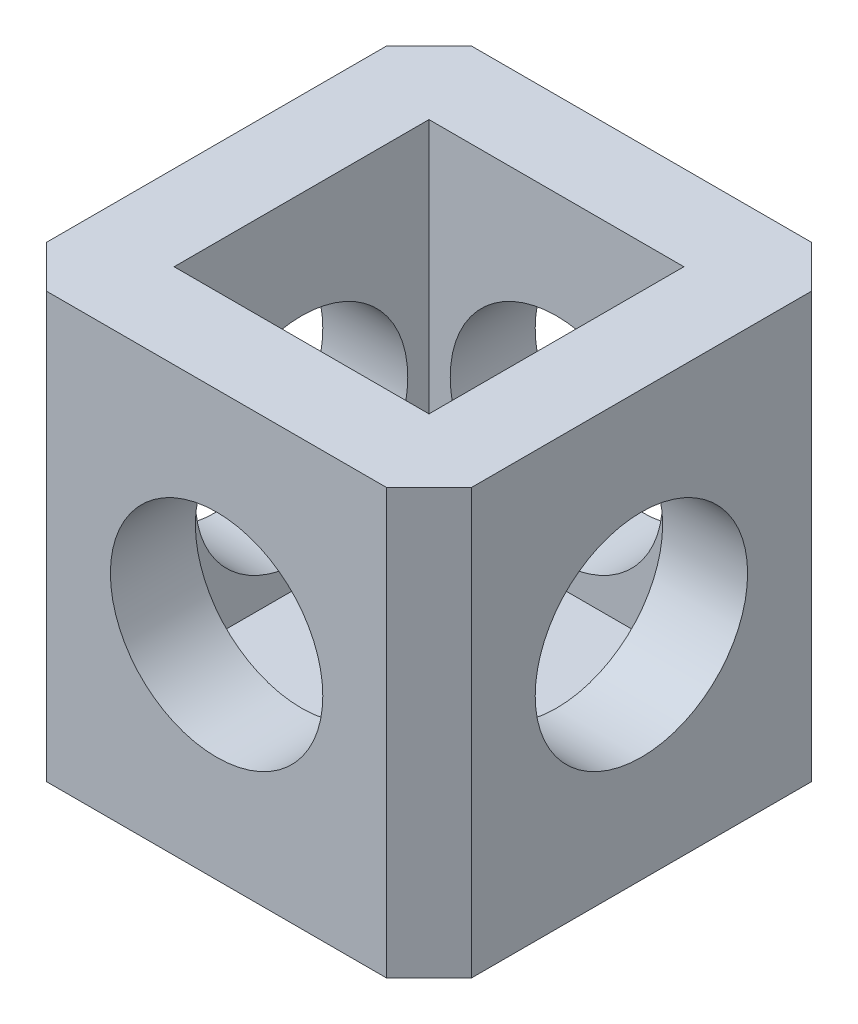
ISO-10303-21;
HEADER;
FILE_DESCRIPTION(('STEP AP214'),'2;1');
FILE_NAME('part.step','',(''),(''),'','','');
FILE_SCHEMA(('AUTOMOTIVE_DESIGN { 1 0 10303 214 1 1 1 1 }'));
ENDSEC;
DATA;
#1=APPLICATION_CONTEXT('core data for automotive mechanical design processes');
#2=APPLICATION_PROTOCOL_DEFINITION('international standard','automotive_design',2000,#1);
#3=PRODUCT_CONTEXT('',#1,'mechanical');
#4=PRODUCT('Part','Part','',(#3));
#5=PRODUCT_RELATED_PRODUCT_CATEGORY('part','',(#4));
#6=PRODUCT_DEFINITION_FORMATION('','',#4);
#7=PRODUCT_DEFINITION_CONTEXT('part definition',#1,'design');
#8=PRODUCT_DEFINITION('design','',#6,#7);
#9=PRODUCT_DEFINITION_SHAPE('','',#8);
#10=(LENGTH_UNIT() NAMED_UNIT(*) SI_UNIT(.MILLI.,.METRE.));
#11=(NAMED_UNIT(*) PLANE_ANGLE_UNIT() SI_UNIT($,.RADIAN.));
#12=(NAMED_UNIT(*) SI_UNIT($,.STERADIAN.) SOLID_ANGLE_UNIT());
#13=UNCERTAINTY_MEASURE_WITH_UNIT(LENGTH_MEASURE(1.E-05),#10,'distance_accuracy_value','');
#14=(GEOMETRIC_REPRESENTATION_CONTEXT(3) GLOBAL_UNCERTAINTY_ASSIGNED_CONTEXT((#13)) GLOBAL_UNIT_ASSIGNED_CONTEXT((#10,
#11,#12)) REPRESENTATION_CONTEXT('',''));
#15=CARTESIAN_POINT('',(0.,0.,0.));
#16=DIRECTION('',(0.,0.,1.));
#17=DIRECTION('',(1.,0.,0.));
#18=AXIS2_PLACEMENT_3D('',#15,#16,#17);
#19=CARTESIAN_POINT('',(-10.,4.,-10.));
#20=DIRECTION('',(0.,0.,1.));
#21=DIRECTION('',(1.,0.,0.));
#22=AXIS2_PLACEMENT_3D('',#19,#20,#21);
#23=PLANE('',#22);
#24=CARTESIAN_POINT('',(0.,10.,-10.));
#25=DIRECTION('',(0.,0.,1.));
#26=DIRECTION('',(1.,0.,0.));
#27=AXIS2_PLACEMENT_3D('',#24,#25,#26);
#28=CIRCLE('',#27,5.);
#29=CARTESIAN_POINT('',(5.,10.,-10.));
#30=VERTEX_POINT('',#29);
#31=EDGE_CURVE('E336',#30,#30,#28,.T.);
#32=ORIENTED_EDGE('',*,*,#31,.T.);
#33=EDGE_LOOP('',(#32));
#34=FACE_BOUND('',#33,.T.);
#35=DIRECTION('',(-1.,0.,0.));
#36=VECTOR('',#35,1.);
#37=CARTESIAN_POINT('',(-10.,20.,-10.));
#38=LINE('',#37,#36);
#39=CARTESIAN_POINT('',(8.,20.,-10.));
#40=VERTEX_POINT('',#39);
#41=CARTESIAN_POINT('',(-7.99999999999999,20.,-10.));
#42=VERTEX_POINT('',#41);
#43=EDGE_CURVE('E178',#40,#42,#38,.T.);
#44=ORIENTED_EDGE('',*,*,#43,.F.);
#45=DIRECTION('',(0.,-1.,0.));
#46=VECTOR('',#45,1.);
#47=CARTESIAN_POINT('',(8.,4.,-10.));
#48=LINE('',#47,#46);
#49=CARTESIAN_POINT('',(8.,0.,-10.));
#50=VERTEX_POINT('',#49);
#51=EDGE_CURVE('E11',#40,#50,#48,.T.);
#52=ORIENTED_EDGE('',*,*,#51,.T.);
#53=DIRECTION('',(-1.,0.,0.));
#54=VECTOR('',#53,1.);
#55=CARTESIAN_POINT('',(-10.,0.,-10.));
#56=LINE('',#55,#54);
#57=CARTESIAN_POINT('',(-7.99999999999999,0.,-10.));
#58=VERTEX_POINT('',#57);
#59=EDGE_CURVE('E180',#50,#58,#56,.T.);
#60=ORIENTED_EDGE('',*,*,#59,.T.);
#61=DIRECTION('',(0.,1.,0.));
#62=VECTOR('',#61,1.);
#63=CARTESIAN_POINT('',(-7.99999999999999,4.,-10.));
#64=LINE('',#63,#62);
#65=EDGE_CURVE('E44',#58,#42,#64,.T.);
#66=ORIENTED_EDGE('',*,*,#65,.T.);
#67=EDGE_LOOP('',(#44,#52,#60,#66));
#68=FACE_BOUND('',#67,.T.);
#69=ADVANCED_FACE('F35',(#34,#68),#23,.F.);
#70=CARTESIAN_POINT('',(-10.,4.,10.));
#71=DIRECTION('',(1.,0.,0.));
#72=DIRECTION('',(0.,0.,-1.));
#73=AXIS2_PLACEMENT_3D('',#70,#71,#72);
#74=PLANE('',#73);
#75=CARTESIAN_POINT('',(-10.,10.,0.));
#76=DIRECTION('',(1.,0.,0.));
#77=DIRECTION('',(0.,0.,-1.));
#78=AXIS2_PLACEMENT_3D('',#75,#76,#77);
#79=CIRCLE('',#78,5.);
#80=CARTESIAN_POINT('',(-10.,10.,-5.));
#81=VERTEX_POINT('',#80);
#82=EDGE_CURVE('E161',#81,#81,#79,.T.);
#83=ORIENTED_EDGE('',*,*,#82,.T.);
#84=EDGE_LOOP('',(#83));
#85=FACE_BOUND('',#84,.T.);
#86=DIRECTION('',(0.,0.,1.));
#87=VECTOR('',#86,1.);
#88=CARTESIAN_POINT('',(-10.,0.,10.));
#89=LINE('',#88,#87);
#90=CARTESIAN_POINT('',(-10.,0.,-8.));
#91=VERTEX_POINT('',#90);
#92=CARTESIAN_POINT('',(-10.,0.,7.99999999999999));
#93=VERTEX_POINT('',#92);
#94=EDGE_CURVE('E182',#91,#93,#89,.T.);
#95=ORIENTED_EDGE('',*,*,#94,.T.);
#96=DIRECTION('',(0.,1.,0.));
#97=VECTOR('',#96,1.);
#98=CARTESIAN_POINT('',(-10.,4.,7.99999999999999));
#99=LINE('',#98,#97);
#100=CARTESIAN_POINT('',(-10.,20.,7.99999999999999));
#101=VERTEX_POINT('',#100);
#102=EDGE_CURVE('E217',#93,#101,#99,.T.);
#103=ORIENTED_EDGE('',*,*,#102,.T.);
#104=DIRECTION('',(0.,0.,1.));
#105=VECTOR('',#104,1.);
#106=CARTESIAN_POINT('',(-10.,20.,-10.));
#107=LINE('',#106,#105);
#108=CARTESIAN_POINT('',(-10.,20.,-8.));
#109=VERTEX_POINT('',#108);
#110=EDGE_CURVE('E146',#109,#101,#107,.T.);
#111=ORIENTED_EDGE('',*,*,#110,.F.);
#112=DIRECTION('',(0.,-1.,0.));
#113=VECTOR('',#112,1.);
#114=CARTESIAN_POINT('',(-10.,4.,-8.));
#115=LINE('',#114,#113);
#116=EDGE_CURVE('E214',#109,#91,#115,.T.);
#117=ORIENTED_EDGE('',*,*,#116,.T.);
#118=EDGE_LOOP('',(#95,#103,#111,#117));
#119=FACE_BOUND('',#118,.T.);
#120=ADVANCED_FACE('F251',(#85,#119),#74,.F.);
#121=CARTESIAN_POINT('',(-10.,4.,10.));
#122=DIRECTION('',(0.,0.,-1.));
#123=DIRECTION('',(-1.,0.,0.));
#124=AXIS2_PLACEMENT_3D('',#121,#122,#123);
#125=PLANE('',#124);
#126=CARTESIAN_POINT('',(0.,10.,10.));
#127=DIRECTION('',(0.,0.,1.));
#128=DIRECTION('',(1.,0.,0.));
#129=AXIS2_PLACEMENT_3D('',#126,#127,#128);
#130=CIRCLE('',#129,5.);
#131=CARTESIAN_POINT('',(5.,10.,10.));
#132=VERTEX_POINT('',#131);
#133=EDGE_CURVE('E201',#132,#132,#130,.T.);
#134=ORIENTED_EDGE('',*,*,#133,.F.);
#135=EDGE_LOOP('',(#134));
#136=FACE_BOUND('',#135,.T.);
#137=DIRECTION('',(1.,0.,0.));
#138=VECTOR('',#137,1.);
#139=CARTESIAN_POINT('',(-10.,20.,10.));
#140=LINE('',#139,#138);
#141=CARTESIAN_POINT('',(-8.,20.,10.));
#142=VERTEX_POINT('',#141);
#143=CARTESIAN_POINT('',(7.99999999999999,20.,10.));
#144=VERTEX_POINT('',#143);
#145=EDGE_CURVE('E173',#142,#144,#140,.T.);
#146=ORIENTED_EDGE('',*,*,#145,.F.);
#147=DIRECTION('',(0.,-1.,0.));
#148=VECTOR('',#147,1.);
#149=CARTESIAN_POINT('',(-8.,4.,10.));
#150=LINE('',#149,#148);
#151=CARTESIAN_POINT('',(-8.,0.,10.));
#152=VERTEX_POINT('',#151);
#153=EDGE_CURVE('E203',#142,#152,#150,.T.);
#154=ORIENTED_EDGE('',*,*,#153,.T.);
#155=DIRECTION('',(1.,0.,0.));
#156=VECTOR('',#155,1.);
#157=CARTESIAN_POINT('',(-10.,0.,10.));
#158=LINE('',#157,#156);
#159=CARTESIAN_POINT('',(7.99999999999999,0.,10.));
#160=VERTEX_POINT('',#159);
#161=EDGE_CURVE('E185',#152,#160,#158,.T.);
#162=ORIENTED_EDGE('',*,*,#161,.T.);
#163=DIRECTION('',(0.,1.,0.));
#164=VECTOR('',#163,1.);
#165=CARTESIAN_POINT('',(7.99999999999999,4.,10.));
#166=LINE('',#165,#164);
#167=EDGE_CURVE('E191',#160,#144,#166,.T.);
#168=ORIENTED_EDGE('',*,*,#167,.T.);
#169=EDGE_LOOP('',(#146,#154,#162,#168));
#170=FACE_BOUND('',#169,.T.);
#171=ADVANCED_FACE('F259',(#136,#170),#125,.F.);
#172=CARTESIAN_POINT('',(10.,4.,10.));
#173=DIRECTION('',(-1.,0.,0.));
#174=DIRECTION('',(0.,0.,1.));
#175=AXIS2_PLACEMENT_3D('',#172,#173,#174);
#176=PLANE('',#175);
#177=CARTESIAN_POINT('',(10.,10.,0.));
#178=DIRECTION('',(1.,0.,0.));
#179=DIRECTION('',(0.,0.,-1.));
#180=AXIS2_PLACEMENT_3D('',#177,#178,#179);
#181=CIRCLE('',#180,5.);
#182=CARTESIAN_POINT('',(10.,10.,-5.));
#183=VERTEX_POINT('',#182);
#184=EDGE_CURVE('E196',#183,#183,#181,.T.);
#185=ORIENTED_EDGE('',*,*,#184,.F.);
#186=EDGE_LOOP('',(#185));
#187=FACE_BOUND('',#186,.T.);
#188=DIRECTION('',(0.,0.,-1.));
#189=VECTOR('',#188,1.);
#190=CARTESIAN_POINT('',(10.,20.,-10.));
#191=LINE('',#190,#189);
#192=CARTESIAN_POINT('',(10.,20.,8.));
#193=VERTEX_POINT('',#192);
#194=CARTESIAN_POINT('',(10.,20.,-7.99999999999999));
#195=VERTEX_POINT('',#194);
#196=EDGE_CURVE('E176',#193,#195,#191,.T.);
#197=ORIENTED_EDGE('',*,*,#196,.F.);
#198=DIRECTION('',(0.,-1.,0.));
#199=VECTOR('',#198,1.);
#200=CARTESIAN_POINT('',(10.,4.,8.));
#201=LINE('',#200,#199);
#202=CARTESIAN_POINT('',(10.,0.,8.));
#203=VERTEX_POINT('',#202);
#204=EDGE_CURVE('E228',#193,#203,#201,.T.);
#205=ORIENTED_EDGE('',*,*,#204,.T.);
#206=DIRECTION('',(0.,0.,-1.));
#207=VECTOR('',#206,1.);
#208=CARTESIAN_POINT('',(10.,0.,10.));
#209=LINE('',#208,#207);
#210=CARTESIAN_POINT('',(10.,0.,-7.99999999999999));
#211=VERTEX_POINT('',#210);
#212=EDGE_CURVE('E188',#203,#211,#209,.T.);
#213=ORIENTED_EDGE('',*,*,#212,.T.);
#214=DIRECTION('',(0.,1.,0.));
#215=VECTOR('',#214,1.);
#216=CARTESIAN_POINT('',(10.,4.,-7.99999999999999));
#217=LINE('',#216,#215);
#218=EDGE_CURVE('E226',#211,#195,#217,.T.);
#219=ORIENTED_EDGE('',*,*,#218,.T.);
#220=EDGE_LOOP('',(#197,#205,#213,#219));
#221=FACE_BOUND('',#220,.T.);
#222=ADVANCED_FACE('F234',(#187,#221),#176,.F.);
#223=CARTESIAN_POINT('',(0.,0.,0.));
#224=DIRECTION('',(0.,1.,0.));
#225=DIRECTION('',(0.,0.,1.));
#226=AXIS2_PLACEMENT_3D('',#223,#224,#225);
#227=PLANE('',#226);
#228=ORIENTED_EDGE('',*,*,#161,.F.);
#229=DIRECTION('',(0.707106781186547,0.,0.707106781186548));
#230=VECTOR('',#229,1.);
#231=CARTESIAN_POINT('',(-8.,0.,10.));
#232=LINE('',#231,#230);
#233=EDGE_CURVE('E212',#152,#93,#232,.F.);
#234=ORIENTED_EDGE('',*,*,#233,.T.);
#235=ORIENTED_EDGE('',*,*,#94,.F.);
#236=DIRECTION('',(-0.707106781186548,0.,0.707106781186547));
#237=VECTOR('',#236,1.);
#238=CARTESIAN_POINT('',(-10.,0.,-8.));
#239=LINE('',#238,#237);
#240=EDGE_CURVE('E206',#91,#58,#239,.F.);
#241=ORIENTED_EDGE('',*,*,#240,.T.);
#242=ORIENTED_EDGE('',*,*,#59,.F.);
#243=DIRECTION('',(-0.707106781186547,0.,-0.707106781186548));
#244=VECTOR('',#243,1.);
#245=CARTESIAN_POINT('',(8.,0.,-10.));
#246=LINE('',#245,#244);
#247=EDGE_CURVE('E208',#50,#211,#246,.F.);
#248=ORIENTED_EDGE('',*,*,#247,.T.);
#249=ORIENTED_EDGE('',*,*,#212,.F.);
#250=DIRECTION('',(0.707106781186548,0.,-0.707106781186547));
#251=VECTOR('',#250,1.);
#252=CARTESIAN_POINT('',(10.,0.,8.));
#253=LINE('',#252,#251);
#254=EDGE_CURVE('E210',#203,#160,#253,.F.);
#255=ORIENTED_EDGE('',*,*,#254,.T.);
#256=EDGE_LOOP('',(#228,#234,#235,#241,#242,#248,#249,#255));
#257=FACE_BOUND('',#256,.T.);
#258=ADVANCED_FACE('F240',(#257),#227,.F.);
#259=CARTESIAN_POINT('',(0.,20.,0.));
#260=DIRECTION('',(0.,1.,0.));
#261=DIRECTION('',(0.,0.,1.));
#262=AXIS2_PLACEMENT_3D('',#259,#260,#261);
#263=PLANE('',#262);
#264=ORIENTED_EDGE('',*,*,#110,.T.);
#265=DIRECTION('',(-0.707106781186547,0.,-0.707106781186548));
#266=VECTOR('',#265,1.);
#267=CARTESIAN_POINT('',(-9.00000000000001,20.,8.99999999999999));
#268=LINE('',#267,#266);
#269=EDGE_CURVE('E224',#101,#142,#268,.F.);
#270=ORIENTED_EDGE('',*,*,#269,.T.);
#271=ORIENTED_EDGE('',*,*,#145,.T.);
#272=DIRECTION('',(-0.707106781186548,0.,0.707106781186547));
#273=VECTOR('',#272,1.);
#274=CARTESIAN_POINT('',(8.99999999999999,20.,9.00000000000001));
#275=LINE('',#274,#273);
#276=EDGE_CURVE('E222',#144,#193,#275,.F.);
#277=ORIENTED_EDGE('',*,*,#276,.T.);
#278=ORIENTED_EDGE('',*,*,#196,.T.);
#279=DIRECTION('',(0.707106781186547,0.,0.707106781186548));
#280=VECTOR('',#279,1.);
#281=CARTESIAN_POINT('',(9.00000000000001,20.,-8.99999999999999));
#282=LINE('',#281,#280);
#283=EDGE_CURVE('E57',#195,#40,#282,.F.);
#284=ORIENTED_EDGE('',*,*,#283,.T.);
#285=ORIENTED_EDGE('',*,*,#43,.T.);
#286=DIRECTION('',(0.707106781186548,0.,-0.707106781186547));
#287=VECTOR('',#286,1.);
#288=CARTESIAN_POINT('',(-8.99999999999999,20.,-9.00000000000001));
#289=LINE('',#288,#287);
#290=EDGE_CURVE('E219',#42,#109,#289,.F.);
#291=ORIENTED_EDGE('',*,*,#290,.T.);
#292=EDGE_LOOP('',(#264,#270,#271,#277,#278,#284,#285,#291));
#293=FACE_BOUND('',#292,.T.);
#294=DIRECTION('',(1.,0.,0.));
#295=VECTOR('',#294,1.);
#296=CARTESIAN_POINT('',(-6.,20.,6.));
#297=LINE('',#296,#295);
#298=CARTESIAN_POINT('',(-6.,20.,6.));
#299=VERTEX_POINT('',#298);
#300=CARTESIAN_POINT('',(6.,20.,6.));
#301=VERTEX_POINT('',#300);
#302=EDGE_CURVE('E137',#299,#301,#297,.T.);
#303=ORIENTED_EDGE('',*,*,#302,.F.);
#304=DIRECTION('',(0.,0.,1.));
#305=VECTOR('',#304,1.);
#306=CARTESIAN_POINT('',(-6.,20.,-6.));
#307=LINE('',#306,#305);
#308=CARTESIAN_POINT('',(-6.,20.,-6.));
#309=VERTEX_POINT('',#308);
#310=EDGE_CURVE('E127',#309,#299,#307,.T.);
#311=ORIENTED_EDGE('',*,*,#310,.F.);
#312=DIRECTION('',(-1.,0.,0.));
#313=VECTOR('',#312,1.);
#314=CARTESIAN_POINT('',(-6.,20.,-6.));
#315=LINE('',#314,#313);
#316=CARTESIAN_POINT('',(6.,20.,-6.));
#317=VERTEX_POINT('',#316);
#318=EDGE_CURVE('E154',#317,#309,#315,.T.);
#319=ORIENTED_EDGE('',*,*,#318,.F.);
#320=DIRECTION('',(0.,0.,-1.));
#321=VECTOR('',#320,1.);
#322=CARTESIAN_POINT('',(6.,20.,-6.));
#323=LINE('',#322,#321);
#324=EDGE_CURVE('E152',#301,#317,#323,.T.);
#325=ORIENTED_EDGE('',*,*,#324,.F.);
#326=EDGE_LOOP('',(#303,#311,#319,#325));
#327=FACE_BOUND('',#326,.T.);
#328=ADVANCED_FACE('F150',(#293,#327),#263,.T.);
#329=CARTESIAN_POINT('',(-6.,20.,-6.));
#330=DIRECTION('',(1.,0.,0.));
#331=DIRECTION('',(0.,0.,-1.));
#332=AXIS2_PLACEMENT_3D('',#329,#330,#331);
#333=PLANE('',#332);
#334=CARTESIAN_POINT('',(-6.,10.,0.));
#335=DIRECTION('',(1.,0.,0.));
#336=DIRECTION('',(0.,0.,-1.));
#337=AXIS2_PLACEMENT_3D('',#334,#335,#336);
#338=CIRCLE('',#337,5.);
#339=CARTESIAN_POINT('',(-6.,10.,-5.));
#340=VERTEX_POINT('',#339);
#341=EDGE_CURVE('E195',#340,#340,#338,.T.);
#342=ORIENTED_EDGE('',*,*,#341,.F.);
#343=EDGE_LOOP('',(#342));
#344=FACE_BOUND('',#343,.T.);
#345=DIRECTION('',(0.,0.,1.));
#346=VECTOR('',#345,1.);
#347=CARTESIAN_POINT('',(-6.,4.,-6.));
#348=LINE('',#347,#346);
#349=CARTESIAN_POINT('',(-6.,4.,-6.));
#350=VERTEX_POINT('',#349);
#351=CARTESIAN_POINT('',(-6.,4.,6.));
#352=VERTEX_POINT('',#351);
#353=EDGE_CURVE('E159',#350,#352,#348,.T.);
#354=ORIENTED_EDGE('',*,*,#353,.F.);
#355=DIRECTION('',(0.,-1.,0.));
#356=VECTOR('',#355,1.);
#357=CARTESIAN_POINT('',(-6.,20.,-6.));
#358=LINE('',#357,#356);
#359=EDGE_CURVE('E133',#309,#350,#358,.T.);
#360=ORIENTED_EDGE('',*,*,#359,.F.);
#361=ORIENTED_EDGE('',*,*,#310,.T.);
#362=DIRECTION('',(0.,-1.,0.));
#363=VECTOR('',#362,1.);
#364=CARTESIAN_POINT('',(-6.,20.,6.));
#365=LINE('',#364,#363);
#366=EDGE_CURVE('E131',#299,#352,#365,.T.);
#367=ORIENTED_EDGE('',*,*,#366,.T.);
#368=EDGE_LOOP('',(#354,#360,#361,#367));
#369=FACE_BOUND('',#368,.T.);
#370=ADVANCED_FACE('F130',(#344,#369),#333,.T.);
#371=CARTESIAN_POINT('',(-6.,20.,6.));
#372=DIRECTION('',(0.,0.,-1.));
#373=DIRECTION('',(-1.,0.,0.));
#374=AXIS2_PLACEMENT_3D('',#371,#372,#373);
#375=PLANE('',#374);
#376=CARTESIAN_POINT('',(0.,10.,6.));
#377=DIRECTION('',(0.,0.,-1.));
#378=DIRECTION('',(-1.,0.,0.));
#379=AXIS2_PLACEMENT_3D('',#376,#377,#378);
#380=CIRCLE('',#379,5.);
#381=CARTESIAN_POINT('',(-5.,10.,6.));
#382=VERTEX_POINT('',#381);
#383=EDGE_CURVE('E200',#382,#382,#380,.T.);
#384=ORIENTED_EDGE('',*,*,#383,.F.);
#385=EDGE_LOOP('',(#384));
#386=FACE_BOUND('',#385,.T.);
#387=DIRECTION('',(1.,0.,0.));
#388=VECTOR('',#387,1.);
#389=CARTESIAN_POINT('',(-6.,4.,6.));
#390=LINE('',#389,#388);
#391=CARTESIAN_POINT('',(6.,4.,6.));
#392=VERTEX_POINT('',#391);
#393=EDGE_CURVE('E145',#352,#392,#390,.T.);
#394=ORIENTED_EDGE('',*,*,#393,.F.);
#395=ORIENTED_EDGE('',*,*,#366,.F.);
#396=ORIENTED_EDGE('',*,*,#302,.T.);
#397=DIRECTION('',(0.,-1.,0.));
#398=VECTOR('',#397,1.);
#399=CARTESIAN_POINT('',(6.,20.,6.));
#400=LINE('',#399,#398);
#401=EDGE_CURVE('E147',#301,#392,#400,.T.);
#402=ORIENTED_EDGE('',*,*,#401,.T.);
#403=EDGE_LOOP('',(#394,#395,#396,#402));
#404=FACE_BOUND('',#403,.T.);
#405=ADVANCED_FACE('F142',(#386,#404),#375,.T.);
#406=CARTESIAN_POINT('',(6.,20.,-6.));
#407=DIRECTION('',(-1.,0.,0.));
#408=DIRECTION('',(0.,0.,1.));
#409=AXIS2_PLACEMENT_3D('',#406,#407,#408);
#410=PLANE('',#409);
#411=CARTESIAN_POINT('',(6.,10.,0.));
#412=DIRECTION('',(-1.,0.,0.));
#413=DIRECTION('',(0.,0.,1.));
#414=AXIS2_PLACEMENT_3D('',#411,#412,#413);
#415=CIRCLE('',#414,5.);
#416=CARTESIAN_POINT('',(6.,10.,5.));
#417=VERTEX_POINT('',#416);
#418=EDGE_CURVE('E192',#417,#417,#415,.T.);
#419=ORIENTED_EDGE('',*,*,#418,.F.);
#420=EDGE_LOOP('',(#419));
#421=FACE_BOUND('',#420,.T.);
#422=DIRECTION('',(0.,0.,-1.));
#423=VECTOR('',#422,1.);
#424=CARTESIAN_POINT('',(6.,4.,-6.));
#425=LINE('',#424,#423);
#426=CARTESIAN_POINT('',(6.,4.,-6.));
#427=VERTEX_POINT('',#426);
#428=EDGE_CURVE('E163',#392,#427,#425,.T.);
#429=ORIENTED_EDGE('',*,*,#428,.F.);
#430=ORIENTED_EDGE('',*,*,#401,.F.);
#431=ORIENTED_EDGE('',*,*,#324,.T.);
#432=DIRECTION('',(0.,-1.,0.));
#433=VECTOR('',#432,1.);
#434=CARTESIAN_POINT('',(6.,20.,-6.));
#435=LINE('',#434,#433);
#436=EDGE_CURVE('E167',#317,#427,#435,.T.);
#437=ORIENTED_EDGE('',*,*,#436,.T.);
#438=EDGE_LOOP('',(#429,#430,#431,#437));
#439=FACE_BOUND('',#438,.T.);
#440=ADVANCED_FACE('F312',(#421,#439),#410,.T.);
#441=CARTESIAN_POINT('',(-6.,20.,-6.));
#442=DIRECTION('',(0.,0.,1.));
#443=DIRECTION('',(1.,0.,0.));
#444=AXIS2_PLACEMENT_3D('',#441,#442,#443);
#445=PLANE('',#444);
#446=CARTESIAN_POINT('',(0.,10.,-6.));
#447=DIRECTION('',(0.,0.,1.));
#448=DIRECTION('',(1.,0.,0.));
#449=AXIS2_PLACEMENT_3D('',#446,#447,#448);
#450=CIRCLE('',#449,5.);
#451=CARTESIAN_POINT('',(5.,10.,-6.));
#452=VERTEX_POINT('',#451);
#453=EDGE_CURVE('E197',#452,#452,#450,.T.);
#454=ORIENTED_EDGE('',*,*,#453,.F.);
#455=EDGE_LOOP('',(#454));
#456=FACE_BOUND('',#455,.T.);
#457=DIRECTION('',(-1.,0.,0.));
#458=VECTOR('',#457,1.);
#459=CARTESIAN_POINT('',(-6.,4.,-6.));
#460=LINE('',#459,#458);
#461=EDGE_CURVE('E138',#427,#350,#460,.T.);
#462=ORIENTED_EDGE('',*,*,#461,.F.);
#463=ORIENTED_EDGE('',*,*,#436,.F.);
#464=ORIENTED_EDGE('',*,*,#318,.T.);
#465=ORIENTED_EDGE('',*,*,#359,.T.);
#466=EDGE_LOOP('',(#462,#463,#464,#465));
#467=FACE_BOUND('',#466,.T.);
#468=ADVANCED_FACE('F303',(#456,#467),#445,.T.);
#469=CARTESIAN_POINT('',(0.,4.,0.));
#470=DIRECTION('',(0.,1.,0.));
#471=DIRECTION('',(0.,0.,1.));
#472=AXIS2_PLACEMENT_3D('',#469,#470,#471);
#473=PLANE('',#472);
#474=ORIENTED_EDGE('',*,*,#353,.T.);
#475=ORIENTED_EDGE('',*,*,#393,.T.);
#476=ORIENTED_EDGE('',*,*,#428,.T.);
#477=ORIENTED_EDGE('',*,*,#461,.T.);
#478=EDGE_LOOP('',(#474,#475,#476,#477));
#479=FACE_BOUND('',#478,.T.);
#480=ADVANCED_FACE('F299',(#479),#473,.T.);
#481=CARTESIAN_POINT('',(-15.,10.,0.));
#482=DIRECTION('',(1.,0.,0.));
#483=DIRECTION('',(0.,0.,-1.));
#484=AXIS2_PLACEMENT_3D('',#481,#482,#483);
#485=CYLINDRICAL_SURFACE('',#484,5.);
#486=ORIENTED_EDGE('',*,*,#418,.T.);
#487=EDGE_LOOP('',(#486));
#488=FACE_BOUND('',#487,.T.);
#489=ORIENTED_EDGE('',*,*,#184,.T.);
#490=EDGE_LOOP('',(#489));
#491=FACE_BOUND('',#490,.T.);
#492=ADVANCED_FACE('F302',(#488,#491),#485,.F.);
#493=ORIENTED_EDGE('',*,*,#341,.T.);
#494=EDGE_LOOP('',(#493));
#495=FACE_BOUND('',#494,.T.);
#496=ORIENTED_EDGE('',*,*,#82,.F.);
#497=EDGE_LOOP('',(#496));
#498=FACE_BOUND('',#497,.T.);
#499=ADVANCED_FACE('F322',(#495,#498),#485,.F.);
#500=CARTESIAN_POINT('',(0.,10.,-15.));
#501=DIRECTION('',(0.,0.,1.));
#502=DIRECTION('',(1.,0.,0.));
#503=AXIS2_PLACEMENT_3D('',#500,#501,#502);
#504=CYLINDRICAL_SURFACE('',#503,5.);
#505=ORIENTED_EDGE('',*,*,#453,.T.);
#506=EDGE_LOOP('',(#505));
#507=FACE_BOUND('',#506,.T.);
#508=ORIENTED_EDGE('',*,*,#31,.F.);
#509=EDGE_LOOP('',(#508));
#510=FACE_BOUND('',#509,.T.);
#511=ADVANCED_FACE('F324',(#507,#510),#504,.F.);
#512=ORIENTED_EDGE('',*,*,#383,.T.);
#513=EDGE_LOOP('',(#512));
#514=FACE_BOUND('',#513,.T.);
#515=ORIENTED_EDGE('',*,*,#133,.T.);
#516=EDGE_LOOP('',(#515));
#517=FACE_BOUND('',#516,.T.);
#518=ADVANCED_FACE('F268',(#514,#517),#504,.F.);
#519=CARTESIAN_POINT('',(-8.,4.,10.));
#520=DIRECTION('',(0.707106781186548,0.,-0.707106781186547));
#521=DIRECTION('',(0.,-1.,0.));
#522=AXIS2_PLACEMENT_3D('',#519,#520,#521);
#523=PLANE('',#522);
#524=ORIENTED_EDGE('',*,*,#269,.F.);
#525=ORIENTED_EDGE('',*,*,#102,.F.);
#526=ORIENTED_EDGE('',*,*,#233,.F.);
#527=ORIENTED_EDGE('',*,*,#153,.F.);
#528=EDGE_LOOP('',(#524,#525,#526,#527));
#529=FACE_BOUND('',#528,.T.);
#530=ADVANCED_FACE('F256',(#529),#523,.F.);
#531=CARTESIAN_POINT('',(10.,4.,8.));
#532=DIRECTION('',(-0.707106781186547,0.,-0.707106781186548));
#533=DIRECTION('',(0.,-1.,0.));
#534=AXIS2_PLACEMENT_3D('',#531,#532,#533);
#535=PLANE('',#534);
#536=ORIENTED_EDGE('',*,*,#276,.F.);
#537=ORIENTED_EDGE('',*,*,#167,.F.);
#538=ORIENTED_EDGE('',*,*,#254,.F.);
#539=ORIENTED_EDGE('',*,*,#204,.F.);
#540=EDGE_LOOP('',(#536,#537,#538,#539));
#541=FACE_BOUND('',#540,.T.);
#542=ADVANCED_FACE('F261',(#541),#535,.F.);
#543=CARTESIAN_POINT('',(8.,4.,-10.));
#544=DIRECTION('',(-0.707106781186548,0.,0.707106781186547));
#545=DIRECTION('',(0.,-1.,0.));
#546=AXIS2_PLACEMENT_3D('',#543,#544,#545);
#547=PLANE('',#546);
#548=ORIENTED_EDGE('',*,*,#283,.F.);
#549=ORIENTED_EDGE('',*,*,#218,.F.);
#550=ORIENTED_EDGE('',*,*,#247,.F.);
#551=ORIENTED_EDGE('',*,*,#51,.F.);
#552=EDGE_LOOP('',(#548,#549,#550,#551));
#553=FACE_BOUND('',#552,.T.);
#554=ADVANCED_FACE('F244',(#553),#547,.F.);
#555=CARTESIAN_POINT('',(-10.,4.,-8.));
#556=DIRECTION('',(0.707106781186547,0.,0.707106781186548));
#557=DIRECTION('',(0.,-1.,0.));
#558=AXIS2_PLACEMENT_3D('',#555,#556,#557);
#559=PLANE('',#558);
#560=ORIENTED_EDGE('',*,*,#290,.F.);
#561=ORIENTED_EDGE('',*,*,#65,.F.);
#562=ORIENTED_EDGE('',*,*,#240,.F.);
#563=ORIENTED_EDGE('',*,*,#116,.F.);
#564=EDGE_LOOP('',(#560,#561,#562,#563));
#565=FACE_BOUND('',#564,.T.);
#566=ADVANCED_FACE('F38',(#565),#559,.F.);
#567=CLOSED_SHELL('',(#69,#120,#171,#222,#258,#328,#370,#405,#440,#468,#480,#492,#499,#511,#518,
#530,#542,#554,#566));
#568=MANIFOLD_SOLID_BREP('B2',#567);
#569=ADVANCED_BREP_SHAPE_REPRESENTATION('',(#18,#568),#14);
#570=SHAPE_DEFINITION_REPRESENTATION(#9,#569);
ENDSEC;
END-ISO-10303-21;
